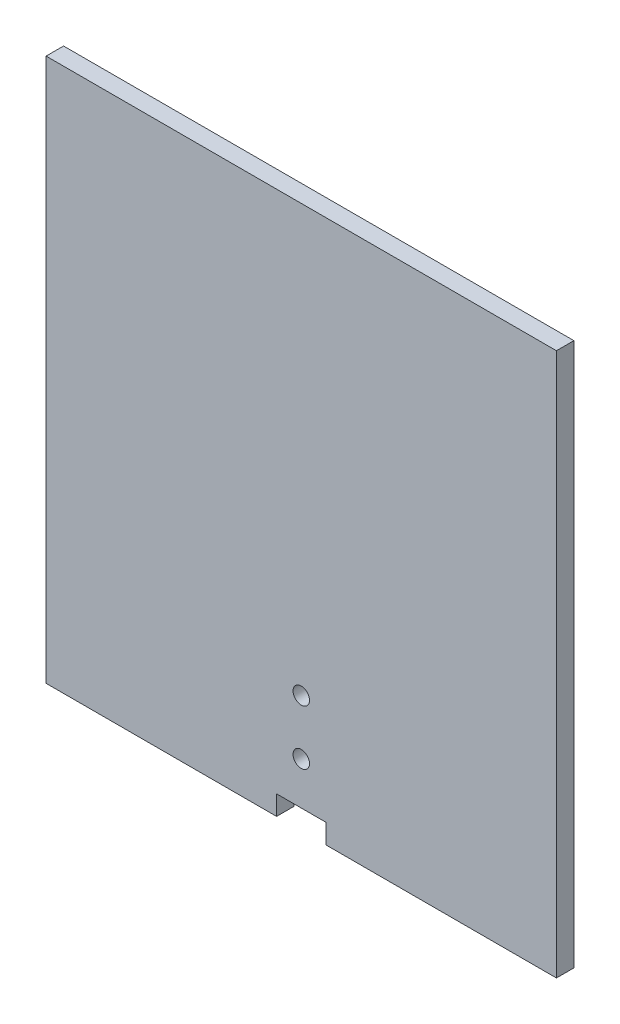
ISO-10303-21;
HEADER;
FILE_DESCRIPTION(('STEP AP214'),'2;1');
FILE_NAME('part.step','',(''),(''),'','','');
FILE_SCHEMA(('AUTOMOTIVE_DESIGN { 1 0 10303 214 1 1 1 1 }'));
ENDSEC;
DATA;
#1=APPLICATION_CONTEXT('core data for automotive mechanical design processes');
#2=APPLICATION_PROTOCOL_DEFINITION('international standard','automotive_design',2000,#1);
#3=PRODUCT_CONTEXT('',#1,'mechanical');
#4=PRODUCT('Part','Part','',(#3));
#5=PRODUCT_RELATED_PRODUCT_CATEGORY('part','',(#4));
#6=PRODUCT_DEFINITION_FORMATION('','',#4);
#7=PRODUCT_DEFINITION_CONTEXT('part definition',#1,'design');
#8=PRODUCT_DEFINITION('design','',#6,#7);
#9=PRODUCT_DEFINITION_SHAPE('','',#8);
#10=(LENGTH_UNIT() NAMED_UNIT(*) SI_UNIT(.MILLI.,.METRE.));
#11=(NAMED_UNIT(*) PLANE_ANGLE_UNIT() SI_UNIT($,.RADIAN.));
#12=(NAMED_UNIT(*) SI_UNIT($,.STERADIAN.) SOLID_ANGLE_UNIT());
#13=UNCERTAINTY_MEASURE_WITH_UNIT(LENGTH_MEASURE(1.E-05),#10,'distance_accuracy_value','');
#14=(GEOMETRIC_REPRESENTATION_CONTEXT(3) GLOBAL_UNCERTAINTY_ASSIGNED_CONTEXT((#13)) GLOBAL_UNIT_ASSIGNED_CONTEXT((#10,
#11,#12)) REPRESENTATION_CONTEXT('',''));
#15=CARTESIAN_POINT('',(0.,0.,0.));
#16=DIRECTION('',(0.,0.,1.));
#17=DIRECTION('',(1.,0.,0.));
#18=AXIS2_PLACEMENT_3D('',#15,#16,#17);
#19=CARTESIAN_POINT('',(-46.5,-49.5,3.18));
#20=DIRECTION('',(0.,1.,0.));
#21=DIRECTION('',(0.,0.,1.));
#22=AXIS2_PLACEMENT_3D('',#19,#20,#21);
#23=PLANE('',#22);
#24=DIRECTION('',(1.,0.,0.));
#25=VECTOR('',#24,1.);
#26=CARTESIAN_POINT('',(-46.5,-49.5,3.18));
#27=LINE('',#26,#25);
#28=CARTESIAN_POINT('',(4.4999999999975,-49.5,3.18));
#29=VERTEX_POINT('',#28);
#30=CARTESIAN_POINT('',(46.5,-49.5,3.18));
#31=VERTEX_POINT('',#30);
#32=EDGE_CURVE('E57',#29,#31,#27,.T.);
#33=ORIENTED_EDGE('',*,*,#32,.F.);
#34=DIRECTION('',(0.,0.,1.));
#35=VECTOR('',#34,1.);
#36=CARTESIAN_POINT('',(4.4999999999975,-49.5,-6.82));
#37=LINE('',#36,#35);
#38=CARTESIAN_POINT('',(4.4999999999975,-49.5,0.));
#39=VERTEX_POINT('',#38);
#40=EDGE_CURVE('E120',#39,#29,#37,.T.);
#41=ORIENTED_EDGE('',*,*,#40,.F.);
#42=DIRECTION('',(1.,0.,0.));
#43=VECTOR('',#42,1.);
#44=CARTESIAN_POINT('',(-46.5,-49.5,0.));
#45=LINE('',#44,#43);
#46=CARTESIAN_POINT('',(46.5,-49.5,0.));
#47=VERTEX_POINT('',#46);
#48=EDGE_CURVE('E79',#39,#47,#45,.T.);
#49=ORIENTED_EDGE('',*,*,#48,.T.);
#50=DIRECTION('',(0.,0.,-1.));
#51=VECTOR('',#50,1.);
#52=CARTESIAN_POINT('',(46.5,-49.5,3.18));
#53=LINE('',#52,#51);
#54=EDGE_CURVE('E148',#31,#47,#53,.T.);
#55=ORIENTED_EDGE('',*,*,#54,.F.);
#56=EDGE_LOOP('',(#33,#41,#49,#55));
#57=FACE_BOUND('',#56,.T.);
#58=ADVANCED_FACE('F33',(#57),#23,.F.);
#59=CARTESIAN_POINT('',(46.5,49.5,3.18));
#60=DIRECTION('',(-1.,0.,0.));
#61=DIRECTION('',(0.,0.,1.));
#62=AXIS2_PLACEMENT_3D('',#59,#60,#61);
#63=PLANE('',#62);
#64=DIRECTION('',(0.,1.,0.));
#65=VECTOR('',#64,1.);
#66=CARTESIAN_POINT('',(46.5,49.5,0.));
#67=LINE('',#66,#65);
#68=CARTESIAN_POINT('',(46.5,49.5,0.));
#69=VERTEX_POINT('',#68);
#70=EDGE_CURVE('E149',#47,#69,#67,.T.);
#71=ORIENTED_EDGE('',*,*,#70,.T.);
#72=DIRECTION('',(0.,0.,-1.));
#73=VECTOR('',#72,1.);
#74=CARTESIAN_POINT('',(46.5,49.5,3.18));
#75=LINE('',#74,#73);
#76=CARTESIAN_POINT('',(46.5,49.5,3.18));
#77=VERTEX_POINT('',#76);
#78=EDGE_CURVE('E166',#77,#69,#75,.T.);
#79=ORIENTED_EDGE('',*,*,#78,.F.);
#80=DIRECTION('',(0.,1.,0.));
#81=VECTOR('',#80,1.);
#82=CARTESIAN_POINT('',(46.5,49.5,3.18));
#83=LINE('',#82,#81);
#84=EDGE_CURVE('E140',#31,#77,#83,.T.);
#85=ORIENTED_EDGE('',*,*,#84,.F.);
#86=ORIENTED_EDGE('',*,*,#54,.T.);
#87=EDGE_LOOP('',(#71,#79,#85,#86));
#88=FACE_BOUND('',#87,.T.);
#89=ADVANCED_FACE('F35',(#88),#63,.F.);
#90=CARTESIAN_POINT('',(-46.5,49.5,3.18));
#91=DIRECTION('',(0.,-1.,0.));
#92=DIRECTION('',(0.,0.,-1.));
#93=AXIS2_PLACEMENT_3D('',#90,#91,#92);
#94=PLANE('',#93);
#95=DIRECTION('',(-1.,0.,0.));
#96=VECTOR('',#95,1.);
#97=CARTESIAN_POINT('',(-46.5,49.5,0.));
#98=LINE('',#97,#96);
#99=CARTESIAN_POINT('',(-46.5,49.5,0.));
#100=VERTEX_POINT('',#99);
#101=EDGE_CURVE('E152',#69,#100,#98,.T.);
#102=ORIENTED_EDGE('',*,*,#101,.T.);
#103=DIRECTION('',(0.,0.,-1.));
#104=VECTOR('',#103,1.);
#105=CARTESIAN_POINT('',(-46.5,49.5,3.18));
#106=LINE('',#105,#104);
#107=CARTESIAN_POINT('',(-46.5,49.5,3.18));
#108=VERTEX_POINT('',#107);
#109=EDGE_CURVE('E163',#108,#100,#106,.T.);
#110=ORIENTED_EDGE('',*,*,#109,.F.);
#111=DIRECTION('',(-1.,0.,0.));
#112=VECTOR('',#111,1.);
#113=CARTESIAN_POINT('',(-46.5,49.5,3.18));
#114=LINE('',#113,#112);
#115=EDGE_CURVE('E87',#77,#108,#114,.T.);
#116=ORIENTED_EDGE('',*,*,#115,.F.);
#117=ORIENTED_EDGE('',*,*,#78,.T.);
#118=EDGE_LOOP('',(#102,#110,#116,#117));
#119=FACE_BOUND('',#118,.T.);
#120=ADVANCED_FACE('F188',(#119),#94,.F.);
#121=CARTESIAN_POINT('',(-46.5,49.5,3.18));
#122=DIRECTION('',(1.,0.,0.));
#123=DIRECTION('',(0.,0.,-1.));
#124=AXIS2_PLACEMENT_3D('',#121,#122,#123);
#125=PLANE('',#124);
#126=DIRECTION('',(0.,-1.,0.));
#127=VECTOR('',#126,1.);
#128=CARTESIAN_POINT('',(-46.5,49.5,0.));
#129=LINE('',#128,#127);
#130=CARTESIAN_POINT('',(-46.5,-49.5,0.));
#131=VERTEX_POINT('',#130);
#132=EDGE_CURVE('E155',#100,#131,#129,.T.);
#133=ORIENTED_EDGE('',*,*,#132,.T.);
#134=DIRECTION('',(0.,0.,-1.));
#135=VECTOR('',#134,1.);
#136=CARTESIAN_POINT('',(-46.5,-49.5,3.18));
#137=LINE('',#136,#135);
#138=CARTESIAN_POINT('',(-46.5,-49.5,3.18));
#139=VERTEX_POINT('',#138);
#140=EDGE_CURVE('E160',#139,#131,#137,.T.);
#141=ORIENTED_EDGE('',*,*,#140,.F.);
#142=DIRECTION('',(0.,-1.,0.));
#143=VECTOR('',#142,1.);
#144=CARTESIAN_POINT('',(-46.5,49.5,3.18));
#145=LINE('',#144,#143);
#146=EDGE_CURVE('E144',#108,#139,#145,.T.);
#147=ORIENTED_EDGE('',*,*,#146,.F.);
#148=ORIENTED_EDGE('',*,*,#109,.T.);
#149=EDGE_LOOP('',(#133,#141,#147,#148));
#150=FACE_BOUND('',#149,.T.);
#151=ADVANCED_FACE('F185',(#150),#125,.F.);
#152=CARTESIAN_POINT('',(-4.50000000000129,-49.5,0.));
#153=VERTEX_POINT('',#152);
#154=EDGE_CURVE('E142',#131,#153,#45,.T.);
#155=ORIENTED_EDGE('',*,*,#154,.T.);
#156=DIRECTION('',(0.,0.,1.));
#157=VECTOR('',#156,1.);
#158=CARTESIAN_POINT('',(-4.50000000000129,-49.5,-6.82));
#159=LINE('',#158,#157);
#160=CARTESIAN_POINT('',(-4.50000000000129,-49.5,3.18));
#161=VERTEX_POINT('',#160);
#162=EDGE_CURVE('E130',#153,#161,#159,.T.);
#163=ORIENTED_EDGE('',*,*,#162,.T.);
#164=EDGE_CURVE('E146',#139,#161,#27,.T.);
#165=ORIENTED_EDGE('',*,*,#164,.F.);
#166=ORIENTED_EDGE('',*,*,#140,.T.);
#167=EDGE_LOOP('',(#155,#163,#165,#166));
#168=FACE_BOUND('',#167,.T.);
#169=ADVANCED_FACE('F180',(#168),#23,.F.);
#170=CARTESIAN_POINT('',(0.,0.,3.18));
#171=DIRECTION('',(0.,0.,1.));
#172=DIRECTION('',(1.,0.,0.));
#173=AXIS2_PLACEMENT_3D('',#170,#171,#172);
#174=PLANE('',#173);
#175=DIRECTION('',(0.,1.,0.));
#176=VECTOR('',#175,1.);
#177=CARTESIAN_POINT('',(4.4999999999975,-45.930000000001,3.18));
#178=LINE('',#177,#176);
#179=CARTESIAN_POINT('',(4.4999999999975,-45.930000000001,3.18));
#180=VERTEX_POINT('',#179);
#181=EDGE_CURVE('E118',#29,#180,#178,.T.);
#182=ORIENTED_EDGE('',*,*,#181,.F.);
#183=ORIENTED_EDGE('',*,*,#32,.T.);
#184=ORIENTED_EDGE('',*,*,#84,.T.);
#185=ORIENTED_EDGE('',*,*,#115,.T.);
#186=ORIENTED_EDGE('',*,*,#146,.T.);
#187=ORIENTED_EDGE('',*,*,#164,.T.);
#188=DIRECTION('',(0.,-1.,0.));
#189=VECTOR('',#188,1.);
#190=CARTESIAN_POINT('',(-4.50000000000129,-45.930000000001,3.18));
#191=LINE('',#190,#189);
#192=CARTESIAN_POINT('',(-4.50000000000129,-45.930000000001,3.18));
#193=VERTEX_POINT('',#192);
#194=EDGE_CURVE('E116',#193,#161,#191,.T.);
#195=ORIENTED_EDGE('',*,*,#194,.F.);
#196=DIRECTION('',(-1.,0.,0.));
#197=VECTOR('',#196,1.);
#198=CARTESIAN_POINT('',(4.4999999999975,-45.930000000001,3.18));
#199=LINE('',#198,#197);
#200=EDGE_CURVE('E111',#180,#193,#199,.T.);
#201=ORIENTED_EDGE('',*,*,#200,.F.);
#202=EDGE_LOOP('',(#182,#183,#184,#185,#186,#187,#195,#201));
#203=FACE_BOUND('',#202,.T.);
#204=CARTESIAN_POINT('',(-1.54910806404729E-12,-38.1799999999996,3.18));
#205=DIRECTION('',(0.,0.,1.));
#206=DIRECTION('',(1.,0.,0.));
#207=AXIS2_PLACEMENT_3D('',#204,#205,#206);
#208=CIRCLE('',#207,1.50000000000361);
#209=CARTESIAN_POINT('',(1.50000000000206,-38.1799999999996,3.18));
#210=VERTEX_POINT('',#209);
#211=EDGE_CURVE('E134',#210,#210,#208,.T.);
#212=ORIENTED_EDGE('',*,*,#211,.F.);
#213=EDGE_LOOP('',(#212));
#214=FACE_BOUND('',#213,.T.);
#215=CARTESIAN_POINT('',(-3.08433834028676E-12,-28.1799999999998,3.18));
#216=DIRECTION('',(0.,0.,1.));
#217=DIRECTION('',(1.,0.,0.));
#218=AXIS2_PLACEMENT_3D('',#215,#216,#217);
#219=CIRCLE('',#218,1.50000000000361);
#220=CARTESIAN_POINT('',(1.50000000000053,-28.1799999999998,3.18));
#221=VERTEX_POINT('',#220);
#222=EDGE_CURVE('E129',#221,#221,#219,.T.);
#223=ORIENTED_EDGE('',*,*,#222,.F.);
#224=EDGE_LOOP('',(#223));
#225=FACE_BOUND('',#224,.T.);
#226=ADVANCED_FACE('F122',(#203,#214,#225),#174,.T.);
#227=CARTESIAN_POINT('',(0.,0.,0.));
#228=DIRECTION('',(0.,0.,1.));
#229=DIRECTION('',(1.,0.,0.));
#230=AXIS2_PLACEMENT_3D('',#227,#228,#229);
#231=PLANE('',#230);
#232=ORIENTED_EDGE('',*,*,#48,.F.);
#233=DIRECTION('',(0.,1.,0.));
#234=VECTOR('',#233,1.);
#235=CARTESIAN_POINT('',(4.4999999999975,0.,0.));
#236=LINE('',#235,#234);
#237=CARTESIAN_POINT('',(4.4999999999975,-45.930000000001,0.));
#238=VERTEX_POINT('',#237);
#239=EDGE_CURVE('E11',#39,#238,#236,.T.);
#240=ORIENTED_EDGE('',*,*,#239,.T.);
#241=DIRECTION('',(-1.,0.,0.));
#242=VECTOR('',#241,1.);
#243=CARTESIAN_POINT('',(0.,-45.930000000001,0.));
#244=LINE('',#243,#242);
#245=CARTESIAN_POINT('',(-4.50000000000129,-45.930000000001,0.));
#246=VERTEX_POINT('',#245);
#247=EDGE_CURVE('E114',#238,#246,#244,.T.);
#248=ORIENTED_EDGE('',*,*,#247,.T.);
#249=DIRECTION('',(0.,-1.,0.));
#250=VECTOR('',#249,1.);
#251=CARTESIAN_POINT('',(-4.50000000000126,0.,0.));
#252=LINE('',#251,#250);
#253=EDGE_CURVE('E41',#246,#153,#252,.T.);
#254=ORIENTED_EDGE('',*,*,#253,.T.);
#255=ORIENTED_EDGE('',*,*,#154,.F.);
#256=ORIENTED_EDGE('',*,*,#132,.F.);
#257=ORIENTED_EDGE('',*,*,#101,.F.);
#258=ORIENTED_EDGE('',*,*,#70,.F.);
#259=EDGE_LOOP('',(#232,#240,#248,#254,#255,#256,#257,#258));
#260=FACE_BOUND('',#259,.T.);
#261=CARTESIAN_POINT('',(-1.54910806404729E-12,-38.1799999999996,0.));
#262=DIRECTION('',(0.,0.,1.));
#263=DIRECTION('',(1.,0.,0.));
#264=AXIS2_PLACEMENT_3D('',#261,#262,#263);
#265=CIRCLE('',#264,1.50000000000361);
#266=CARTESIAN_POINT('',(1.50000000000206,-38.1799999999996,0.));
#267=VERTEX_POINT('',#266);
#268=EDGE_CURVE('E153',#267,#267,#265,.T.);
#269=ORIENTED_EDGE('',*,*,#268,.T.);
#270=EDGE_LOOP('',(#269));
#271=FACE_BOUND('',#270,.T.);
#272=CARTESIAN_POINT('',(-3.08433834028676E-12,-28.1799999999998,0.));
#273=DIRECTION('',(0.,0.,1.));
#274=DIRECTION('',(1.,0.,0.));
#275=AXIS2_PLACEMENT_3D('',#272,#273,#274);
#276=CIRCLE('',#275,1.50000000000361);
#277=CARTESIAN_POINT('',(1.50000000000053,-28.1799999999998,0.));
#278=VERTEX_POINT('',#277);
#279=EDGE_CURVE('E137',#278,#278,#276,.T.);
#280=ORIENTED_EDGE('',*,*,#279,.T.);
#281=EDGE_LOOP('',(#280));
#282=FACE_BOUND('',#281,.T.);
#283=ADVANCED_FACE('F175',(#260,#271,#282),#231,.F.);
#284=CARTESIAN_POINT('',(-3.08433834028676E-12,-28.1799999999998,-6.82));
#285=DIRECTION('',(0.,0.,1.));
#286=DIRECTION('',(1.,0.,0.));
#287=AXIS2_PLACEMENT_3D('',#284,#285,#286);
#288=CYLINDRICAL_SURFACE('',#287,1.50000000000361);
#289=ORIENTED_EDGE('',*,*,#222,.T.);
#290=EDGE_LOOP('',(#289));
#291=FACE_BOUND('',#290,.T.);
#292=ORIENTED_EDGE('',*,*,#279,.F.);
#293=EDGE_LOOP('',(#292));
#294=FACE_BOUND('',#293,.T.);
#295=ADVANCED_FACE('F239',(#291,#294),#288,.F.);
#296=CARTESIAN_POINT('',(-1.54910806404729E-12,-38.1799999999996,-6.82));
#297=DIRECTION('',(0.,0.,1.));
#298=DIRECTION('',(1.,0.,0.));
#299=AXIS2_PLACEMENT_3D('',#296,#297,#298);
#300=CYLINDRICAL_SURFACE('',#299,1.50000000000361);
#301=ORIENTED_EDGE('',*,*,#211,.T.);
#302=EDGE_LOOP('',(#301));
#303=FACE_BOUND('',#302,.T.);
#304=ORIENTED_EDGE('',*,*,#268,.F.);
#305=EDGE_LOOP('',(#304));
#306=FACE_BOUND('',#305,.T.);
#307=ADVANCED_FACE('F246',(#303,#306),#300,.F.);
#308=CARTESIAN_POINT('',(4.4999999999975,-45.930000000001,-6.82));
#309=DIRECTION('',(1.,0.,0.));
#310=DIRECTION('',(0.,0.,-1.));
#311=AXIS2_PLACEMENT_3D('',#308,#309,#310);
#312=PLANE('',#311);
#313=ORIENTED_EDGE('',*,*,#40,.T.);
#314=ORIENTED_EDGE('',*,*,#181,.T.);
#315=DIRECTION('',(0.,0.,1.));
#316=VECTOR('',#315,1.);
#317=CARTESIAN_POINT('',(4.4999999999975,-45.930000000001,-6.82));
#318=LINE('',#317,#316);
#319=EDGE_CURVE('E107',#238,#180,#318,.T.);
#320=ORIENTED_EDGE('',*,*,#319,.F.);
#321=ORIENTED_EDGE('',*,*,#239,.F.);
#322=EDGE_LOOP('',(#313,#314,#320,#321));
#323=FACE_BOUND('',#322,.T.);
#324=ADVANCED_FACE('F119',(#323),#312,.F.);
#325=CARTESIAN_POINT('',(-4.50000000000129,-45.930000000001,-6.82));
#326=DIRECTION('',(-1.,0.,0.));
#327=DIRECTION('',(0.,-1.,0.));
#328=AXIS2_PLACEMENT_3D('',#325,#326,#327);
#329=PLANE('',#328);
#330=DIRECTION('',(0.,0.,1.));
#331=VECTOR('',#330,1.);
#332=CARTESIAN_POINT('',(-4.50000000000129,-45.930000000001,-6.82));
#333=LINE('',#332,#331);
#334=EDGE_CURVE('E48',#246,#193,#333,.T.);
#335=ORIENTED_EDGE('',*,*,#334,.T.);
#336=ORIENTED_EDGE('',*,*,#194,.T.);
#337=ORIENTED_EDGE('',*,*,#162,.F.);
#338=ORIENTED_EDGE('',*,*,#253,.F.);
#339=EDGE_LOOP('',(#335,#336,#337,#338));
#340=FACE_BOUND('',#339,.T.);
#341=ADVANCED_FACE('F266',(#340),#329,.F.);
#342=CARTESIAN_POINT('',(4.4999999999975,-45.930000000001,-6.82));
#343=DIRECTION('',(0.,1.,0.));
#344=DIRECTION('',(0.,0.,1.));
#345=AXIS2_PLACEMENT_3D('',#342,#343,#344);
#346=PLANE('',#345);
#347=ORIENTED_EDGE('',*,*,#319,.T.);
#348=ORIENTED_EDGE('',*,*,#200,.T.);
#349=ORIENTED_EDGE('',*,*,#334,.F.);
#350=ORIENTED_EDGE('',*,*,#247,.F.);
#351=EDGE_LOOP('',(#347,#348,#349,#350));
#352=FACE_BOUND('',#351,.T.);
#353=ADVANCED_FACE('F109',(#352),#346,.F.);
#354=CLOSED_SHELL('',(#58,#89,#120,#151,#169,#226,#283,#295,#307,#324,#341,#353));
#355=MANIFOLD_SOLID_BREP('B2',#354);
#356=ADVANCED_BREP_SHAPE_REPRESENTATION('',(#18,#355),#14);
#357=SHAPE_DEFINITION_REPRESENTATION(#9,#356);
ENDSEC;
END-ISO-10303-21;
